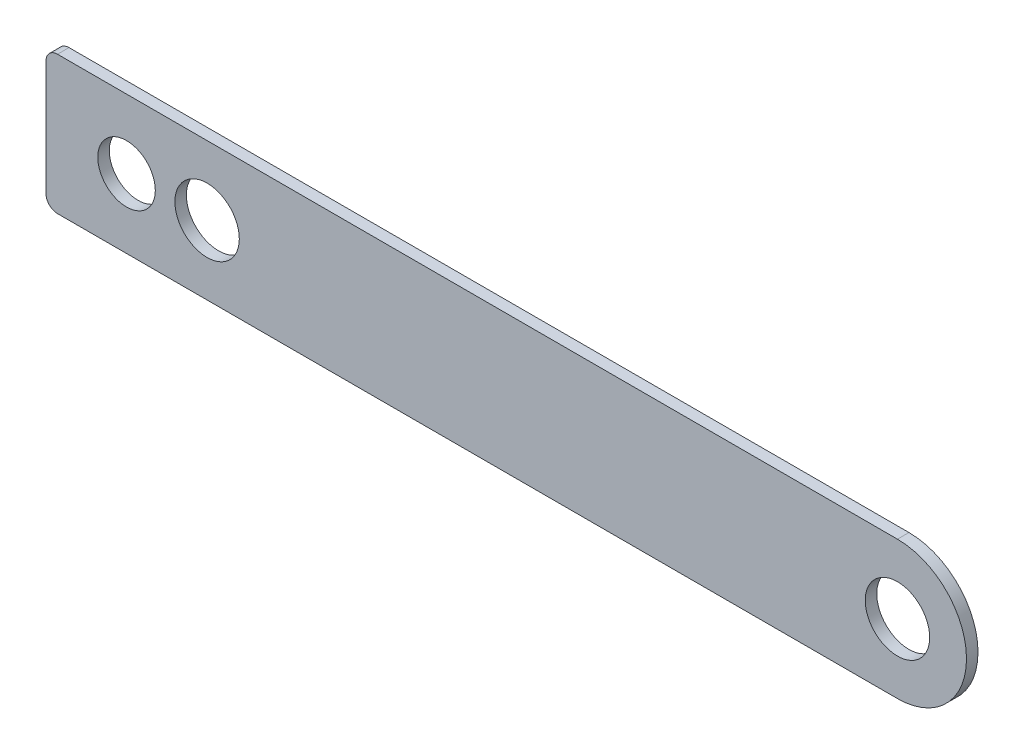
ISO-10303-21;
HEADER;
FILE_DESCRIPTION(('STEP AP214'),'2;1');
FILE_NAME('part.step','',(''),(''),'','','');
FILE_SCHEMA(('AUTOMOTIVE_DESIGN { 1 0 10303 214 1 1 1 1 }'));
ENDSEC;
DATA;
#1=APPLICATION_CONTEXT('core data for automotive mechanical design processes');
#2=APPLICATION_PROTOCOL_DEFINITION('international standard','automotive_design',2000,#1);
#3=PRODUCT_CONTEXT('',#1,'mechanical');
#4=PRODUCT('Part','Part','',(#3));
#5=PRODUCT_RELATED_PRODUCT_CATEGORY('part','',(#4));
#6=PRODUCT_DEFINITION_FORMATION('','',#4);
#7=PRODUCT_DEFINITION_CONTEXT('part definition',#1,'design');
#8=PRODUCT_DEFINITION('design','',#6,#7);
#9=PRODUCT_DEFINITION_SHAPE('','',#8);
#10=(LENGTH_UNIT() NAMED_UNIT(*) SI_UNIT(.MILLI.,.METRE.));
#11=(NAMED_UNIT(*) PLANE_ANGLE_UNIT() SI_UNIT($,.RADIAN.));
#12=(NAMED_UNIT(*) SI_UNIT($,.STERADIAN.) SOLID_ANGLE_UNIT());
#13=UNCERTAINTY_MEASURE_WITH_UNIT(LENGTH_MEASURE(1.E-05),#10,'distance_accuracy_value','');
#14=(GEOMETRIC_REPRESENTATION_CONTEXT(3) GLOBAL_UNCERTAINTY_ASSIGNED_CONTEXT((#13)) GLOBAL_UNIT_ASSIGNED_CONTEXT((#10,
#11,#12)) REPRESENTATION_CONTEXT('',''));
#15=CARTESIAN_POINT('',(0.,0.,0.));
#16=DIRECTION('',(0.,0.,1.));
#17=DIRECTION('',(1.,0.,0.));
#18=AXIS2_PLACEMENT_3D('',#15,#16,#17);
#19=CARTESIAN_POINT('',(370.,30.,5.));
#20=DIRECTION('',(0.,0.,-1.));
#21=DIRECTION('',(-1.,0.,0.));
#22=AXIS2_PLACEMENT_3D('',#19,#20,#21);
#23=CYLINDRICAL_SURFACE('',#22,30.);
#24=CARTESIAN_POINT('',(370.,30.,0.));
#25=DIRECTION('',(0.,0.,1.));
#26=DIRECTION('',(-1.,0.,0.));
#27=AXIS2_PLACEMENT_3D('',#24,#25,#26);
#28=CIRCLE('',#27,30.);
#29=CARTESIAN_POINT('',(370.,0.,0.));
#30=VERTEX_POINT('',#29);
#31=CARTESIAN_POINT('',(370.,60.,0.));
#32=VERTEX_POINT('',#31);
#33=EDGE_CURVE('E123',#30,#32,#28,.T.);
#34=ORIENTED_EDGE('',*,*,#33,.T.);
#35=DIRECTION('',(0.,0.,-1.));
#36=VECTOR('',#35,1.);
#37=CARTESIAN_POINT('',(370.,60.,5.));
#38=LINE('',#37,#36);
#39=CARTESIAN_POINT('',(370.,60.,5.));
#40=VERTEX_POINT('',#39);
#41=EDGE_CURVE('E11',#40,#32,#38,.T.);
#42=ORIENTED_EDGE('',*,*,#41,.F.);
#43=CARTESIAN_POINT('',(370.,30.,5.));
#44=DIRECTION('',(0.,0.,1.));
#45=DIRECTION('',(-1.,0.,0.));
#46=AXIS2_PLACEMENT_3D('',#43,#44,#45);
#47=CIRCLE('',#46,30.);
#48=CARTESIAN_POINT('',(370.,0.,5.));
#49=VERTEX_POINT('',#48);
#50=EDGE_CURVE('E134',#49,#40,#47,.T.);
#51=ORIENTED_EDGE('',*,*,#50,.F.);
#52=DIRECTION('',(0.,0.,-1.));
#53=VECTOR('',#52,1.);
#54=CARTESIAN_POINT('',(370.,0.,5.));
#55=LINE('',#54,#53);
#56=EDGE_CURVE('E119',#49,#30,#55,.T.);
#57=ORIENTED_EDGE('',*,*,#56,.T.);
#58=EDGE_LOOP('',(#34,#42,#51,#57));
#59=FACE_BOUND('',#58,.T.);
#60=ADVANCED_FACE('F39',(#59),#23,.T.);
#61=CARTESIAN_POINT('',(5.00000000000004,60.,5.));
#62=DIRECTION('',(0.,-1.,0.));
#63=DIRECTION('',(0.,0.,-1.));
#64=AXIS2_PLACEMENT_3D('',#61,#62,#63);
#65=PLANE('',#64);
#66=DIRECTION('',(-1.,0.,0.));
#67=VECTOR('',#66,1.);
#68=CARTESIAN_POINT('',(5.00000000000004,60.,0.));
#69=LINE('',#68,#67);
#70=CARTESIAN_POINT('',(5.00000000000004,60.,0.));
#71=VERTEX_POINT('',#70);
#72=EDGE_CURVE('E126',#32,#71,#69,.T.);
#73=ORIENTED_EDGE('',*,*,#72,.T.);
#74=DIRECTION('',(0.,0.,-1.));
#75=VECTOR('',#74,1.);
#76=CARTESIAN_POINT('',(5.00000000000004,60.,5.));
#77=LINE('',#76,#75);
#78=CARTESIAN_POINT('',(5.00000000000004,60.,5.));
#79=VERTEX_POINT('',#78);
#80=EDGE_CURVE('E47',#79,#71,#77,.T.);
#81=ORIENTED_EDGE('',*,*,#80,.F.);
#82=DIRECTION('',(-1.,0.,0.));
#83=VECTOR('',#82,1.);
#84=CARTESIAN_POINT('',(5.00000000000004,60.,5.));
#85=LINE('',#84,#83);
#86=EDGE_CURVE('E92',#40,#79,#85,.T.);
#87=ORIENTED_EDGE('',*,*,#86,.F.);
#88=ORIENTED_EDGE('',*,*,#41,.T.);
#89=EDGE_LOOP('',(#73,#81,#87,#88));
#90=FACE_BOUND('',#89,.T.);
#91=ADVANCED_FACE('F159',(#90),#65,.F.);
#92=CARTESIAN_POINT('',(5.,55.,5.));
#93=DIRECTION('',(0.,0.,-1.));
#94=DIRECTION('',(-1.,0.,0.));
#95=AXIS2_PLACEMENT_3D('',#92,#93,#94);
#96=CYLINDRICAL_SURFACE('',#95,5.);
#97=CARTESIAN_POINT('',(5.,55.,0.));
#98=DIRECTION('',(0.,0.,1.));
#99=DIRECTION('',(-1.,0.,0.));
#100=AXIS2_PLACEMENT_3D('',#97,#98,#99);
#101=CIRCLE('',#100,5.);
#102=CARTESIAN_POINT('',(0.,55.,0.));
#103=VERTEX_POINT('',#102);
#104=EDGE_CURVE('E129',#71,#103,#101,.T.);
#105=ORIENTED_EDGE('',*,*,#104,.T.);
#106=DIRECTION('',(0.,0.,-1.));
#107=VECTOR('',#106,1.);
#108=CARTESIAN_POINT('',(0.,55.,5.));
#109=LINE('',#108,#107);
#110=CARTESIAN_POINT('',(0.,55.,5.));
#111=VERTEX_POINT('',#110);
#112=EDGE_CURVE('E114',#111,#103,#109,.T.);
#113=ORIENTED_EDGE('',*,*,#112,.F.);
#114=CARTESIAN_POINT('',(5.,55.,5.));
#115=DIRECTION('',(0.,0.,1.));
#116=DIRECTION('',(-1.,0.,0.));
#117=AXIS2_PLACEMENT_3D('',#114,#115,#116);
#118=CIRCLE('',#117,5.);
#119=EDGE_CURVE('E105',#79,#111,#118,.T.);
#120=ORIENTED_EDGE('',*,*,#119,.F.);
#121=ORIENTED_EDGE('',*,*,#80,.T.);
#122=EDGE_LOOP('',(#105,#113,#120,#121));
#123=FACE_BOUND('',#122,.T.);
#124=ADVANCED_FACE('F140',(#123),#96,.T.);
#125=CARTESIAN_POINT('',(0.,5.00000000000004,5.));
#126=DIRECTION('',(1.,0.,0.));
#127=DIRECTION('',(0.,0.,-1.));
#128=AXIS2_PLACEMENT_3D('',#125,#126,#127);
#129=PLANE('',#128);
#130=DIRECTION('',(0.,-1.,0.));
#131=VECTOR('',#130,1.);
#132=CARTESIAN_POINT('',(0.,5.00000000000004,0.));
#133=LINE('',#132,#131);
#134=CARTESIAN_POINT('',(0.,5.00000000000004,0.));
#135=VERTEX_POINT('',#134);
#136=EDGE_CURVE('E113',#103,#135,#133,.T.);
#137=ORIENTED_EDGE('',*,*,#136,.T.);
#138=DIRECTION('',(0.,0.,-1.));
#139=VECTOR('',#138,1.);
#140=CARTESIAN_POINT('',(0.,5.00000000000004,5.));
#141=LINE('',#140,#139);
#142=CARTESIAN_POINT('',(0.,5.00000000000004,5.));
#143=VERTEX_POINT('',#142);
#144=EDGE_CURVE('E110',#143,#135,#141,.T.);
#145=ORIENTED_EDGE('',*,*,#144,.F.);
#146=DIRECTION('',(0.,-1.,0.));
#147=VECTOR('',#146,1.);
#148=CARTESIAN_POINT('',(0.,5.00000000000004,5.));
#149=LINE('',#148,#147);
#150=EDGE_CURVE('E99',#111,#143,#149,.T.);
#151=ORIENTED_EDGE('',*,*,#150,.F.);
#152=ORIENTED_EDGE('',*,*,#112,.T.);
#153=EDGE_LOOP('',(#137,#145,#151,#152));
#154=FACE_BOUND('',#153,.T.);
#155=ADVANCED_FACE('F111',(#154),#129,.F.);
#156=CARTESIAN_POINT('',(5.,5.,5.));
#157=DIRECTION('',(0.,0.,-1.));
#158=DIRECTION('',(-1.,0.,0.));
#159=AXIS2_PLACEMENT_3D('',#156,#157,#158);
#160=CYLINDRICAL_SURFACE('',#159,5.);
#161=CARTESIAN_POINT('',(5.,5.,0.));
#162=DIRECTION('',(0.,0.,1.));
#163=DIRECTION('',(-1.,0.,0.));
#164=AXIS2_PLACEMENT_3D('',#161,#162,#163);
#165=CIRCLE('',#164,5.);
#166=CARTESIAN_POINT('',(5.00000000000004,0.,0.));
#167=VERTEX_POINT('',#166);
#168=EDGE_CURVE('E78',#135,#167,#165,.T.);
#169=ORIENTED_EDGE('',*,*,#168,.T.);
#170=DIRECTION('',(0.,0.,-1.));
#171=VECTOR('',#170,1.);
#172=CARTESIAN_POINT('',(5.00000000000004,0.,5.));
#173=LINE('',#172,#171);
#174=CARTESIAN_POINT('',(5.00000000000004,0.,5.));
#175=VERTEX_POINT('',#174);
#176=EDGE_CURVE('E115',#175,#167,#173,.T.);
#177=ORIENTED_EDGE('',*,*,#176,.F.);
#178=CARTESIAN_POINT('',(5.,5.,5.));
#179=DIRECTION('',(0.,0.,1.));
#180=DIRECTION('',(-1.,0.,0.));
#181=AXIS2_PLACEMENT_3D('',#178,#179,#180);
#182=CIRCLE('',#181,5.);
#183=EDGE_CURVE('E103',#143,#175,#182,.T.);
#184=ORIENTED_EDGE('',*,*,#183,.F.);
#185=ORIENTED_EDGE('',*,*,#144,.T.);
#186=EDGE_LOOP('',(#169,#177,#184,#185));
#187=FACE_BOUND('',#186,.T.);
#188=ADVANCED_FACE('F117',(#187),#160,.T.);
#189=CARTESIAN_POINT('',(5.00000000000004,0.,5.));
#190=DIRECTION('',(0.,1.,0.));
#191=DIRECTION('',(0.,0.,1.));
#192=AXIS2_PLACEMENT_3D('',#189,#190,#191);
#193=PLANE('',#192);
#194=DIRECTION('',(1.,0.,0.));
#195=VECTOR('',#194,1.);
#196=CARTESIAN_POINT('',(5.00000000000004,0.,0.));
#197=LINE('',#196,#195);
#198=EDGE_CURVE('E84',#167,#30,#197,.T.);
#199=ORIENTED_EDGE('',*,*,#198,.T.);
#200=ORIENTED_EDGE('',*,*,#56,.F.);
#201=DIRECTION('',(1.,0.,0.));
#202=VECTOR('',#201,1.);
#203=CARTESIAN_POINT('',(5.00000000000004,0.,5.));
#204=LINE('',#203,#202);
#205=EDGE_CURVE('E55',#175,#49,#204,.T.);
#206=ORIENTED_EDGE('',*,*,#205,.F.);
#207=ORIENTED_EDGE('',*,*,#176,.T.);
#208=EDGE_LOOP('',(#199,#200,#206,#207));
#209=FACE_BOUND('',#208,.T.);
#210=ADVANCED_FACE('F147',(#209),#193,.F.);
#211=CARTESIAN_POINT('',(370.,30.,5.));
#212=DIRECTION('',(0.,0.,-1.));
#213=DIRECTION('',(-1.,0.,0.));
#214=AXIS2_PLACEMENT_3D('',#211,#212,#213);
#215=PLANE('',#214);
#216=CARTESIAN_POINT('',(35.,30.,5.));
#217=DIRECTION('',(0.,0.,1.));
#218=DIRECTION('',(1.,0.,0.));
#219=AXIS2_PLACEMENT_3D('',#216,#217,#218);
#220=CIRCLE('',#219,12.5);
#221=CARTESIAN_POINT('',(47.5,30.,5.));
#222=VERTEX_POINT('',#221);
#223=EDGE_CURVE('E270',#222,#222,#220,.T.);
#224=ORIENTED_EDGE('',*,*,#223,.F.);
#225=EDGE_LOOP('',(#224));
#226=FACE_BOUND('',#225,.T.);
#227=CARTESIAN_POINT('',(370.,30.,5.));
#228=DIRECTION('',(0.,0.,1.));
#229=DIRECTION('',(1.,0.,0.));
#230=AXIS2_PLACEMENT_3D('',#227,#228,#229);
#231=CIRCLE('',#230,14.);
#232=CARTESIAN_POINT('',(384.,30.,5.));
#233=VERTEX_POINT('',#232);
#234=EDGE_CURVE('E271',#233,#233,#231,.T.);
#235=ORIENTED_EDGE('',*,*,#234,.F.);
#236=EDGE_LOOP('',(#235));
#237=FACE_BOUND('',#236,.T.);
#238=CARTESIAN_POINT('',(70.,30.,5.));
#239=DIRECTION('',(0.,0.,1.));
#240=DIRECTION('',(1.,0.,0.));
#241=AXIS2_PLACEMENT_3D('',#238,#239,#240);
#242=CIRCLE('',#241,14.);
#243=CARTESIAN_POINT('',(84.,30.,5.));
#244=VERTEX_POINT('',#243);
#245=EDGE_CURVE('E280',#244,#244,#242,.T.);
#246=ORIENTED_EDGE('',*,*,#245,.F.);
#247=EDGE_LOOP('',(#246));
#248=FACE_BOUND('',#247,.T.);
#249=ORIENTED_EDGE('',*,*,#50,.T.);
#250=ORIENTED_EDGE('',*,*,#86,.T.);
#251=ORIENTED_EDGE('',*,*,#119,.T.);
#252=ORIENTED_EDGE('',*,*,#150,.T.);
#253=ORIENTED_EDGE('',*,*,#183,.T.);
#254=ORIENTED_EDGE('',*,*,#205,.T.);
#255=EDGE_LOOP('',(#249,#250,#251,#252,#253,#254));
#256=FACE_BOUND('',#255,.T.);
#257=ADVANCED_FACE('F101',(#226,#237,#248,#256),#215,.F.);
#258=CARTESIAN_POINT('',(370.,30.,0.));
#259=DIRECTION('',(0.,0.,-1.));
#260=DIRECTION('',(-1.,0.,0.));
#261=AXIS2_PLACEMENT_3D('',#258,#259,#260);
#262=PLANE('',#261);
#263=CARTESIAN_POINT('',(35.,30.,0.));
#264=DIRECTION('',(0.,0.,1.));
#265=DIRECTION('',(1.,0.,0.));
#266=AXIS2_PLACEMENT_3D('',#263,#264,#265);
#267=CIRCLE('',#266,12.5);
#268=CARTESIAN_POINT('',(47.5,30.,0.));
#269=VERTEX_POINT('',#268);
#270=EDGE_CURVE('E127',#269,#269,#267,.T.);
#271=ORIENTED_EDGE('',*,*,#270,.T.);
#272=EDGE_LOOP('',(#271));
#273=FACE_BOUND('',#272,.T.);
#274=CARTESIAN_POINT('',(370.,30.,0.));
#275=DIRECTION('',(0.,0.,1.));
#276=DIRECTION('',(1.,0.,0.));
#277=AXIS2_PLACEMENT_3D('',#274,#275,#276);
#278=CIRCLE('',#277,14.);
#279=CARTESIAN_POINT('',(384.,30.,0.));
#280=VERTEX_POINT('',#279);
#281=EDGE_CURVE('E275',#280,#280,#278,.T.);
#282=ORIENTED_EDGE('',*,*,#281,.T.);
#283=EDGE_LOOP('',(#282));
#284=FACE_BOUND('',#283,.T.);
#285=CARTESIAN_POINT('',(70.,30.,0.));
#286=DIRECTION('',(0.,0.,1.));
#287=DIRECTION('',(1.,0.,0.));
#288=AXIS2_PLACEMENT_3D('',#285,#286,#287);
#289=CIRCLE('',#288,14.);
#290=CARTESIAN_POINT('',(84.,30.,0.));
#291=VERTEX_POINT('',#290);
#292=EDGE_CURVE('E283',#291,#291,#289,.T.);
#293=ORIENTED_EDGE('',*,*,#292,.T.);
#294=EDGE_LOOP('',(#293));
#295=FACE_BOUND('',#294,.T.);
#296=ORIENTED_EDGE('',*,*,#33,.F.);
#297=ORIENTED_EDGE('',*,*,#198,.F.);
#298=ORIENTED_EDGE('',*,*,#168,.F.);
#299=ORIENTED_EDGE('',*,*,#136,.F.);
#300=ORIENTED_EDGE('',*,*,#104,.F.);
#301=ORIENTED_EDGE('',*,*,#72,.F.);
#302=EDGE_LOOP('',(#296,#297,#298,#299,#300,#301));
#303=FACE_BOUND('',#302,.T.);
#304=ADVANCED_FACE('F143',(#273,#284,#295,#303),#262,.T.);
#305=CARTESIAN_POINT('',(70.,30.,0.));
#306=DIRECTION('',(0.,0.,1.));
#307=DIRECTION('',(1.,0.,0.));
#308=AXIS2_PLACEMENT_3D('',#305,#306,#307);
#309=CYLINDRICAL_SURFACE('',#308,14.);
#310=ORIENTED_EDGE('',*,*,#292,.F.);
#311=EDGE_LOOP('',(#310));
#312=FACE_BOUND('',#311,.T.);
#313=ORIENTED_EDGE('',*,*,#245,.T.);
#314=EDGE_LOOP('',(#313));
#315=FACE_BOUND('',#314,.T.);
#316=ADVANCED_FACE('F199',(#312,#315),#309,.F.);
#317=CARTESIAN_POINT('',(370.,30.,0.));
#318=DIRECTION('',(0.,0.,1.));
#319=DIRECTION('',(1.,0.,0.));
#320=AXIS2_PLACEMENT_3D('',#317,#318,#319);
#321=CYLINDRICAL_SURFACE('',#320,14.);
#322=ORIENTED_EDGE('',*,*,#281,.F.);
#323=EDGE_LOOP('',(#322));
#324=FACE_BOUND('',#323,.T.);
#325=ORIENTED_EDGE('',*,*,#234,.T.);
#326=EDGE_LOOP('',(#325));
#327=FACE_BOUND('',#326,.T.);
#328=ADVANCED_FACE('F209',(#324,#327),#321,.F.);
#329=CARTESIAN_POINT('',(35.,30.,0.));
#330=DIRECTION('',(0.,0.,1.));
#331=DIRECTION('',(1.,0.,0.));
#332=AXIS2_PLACEMENT_3D('',#329,#330,#331);
#333=CYLINDRICAL_SURFACE('',#332,12.5);
#334=ORIENTED_EDGE('',*,*,#270,.F.);
#335=EDGE_LOOP('',(#334));
#336=FACE_BOUND('',#335,.T.);
#337=ORIENTED_EDGE('',*,*,#223,.T.);
#338=EDGE_LOOP('',(#337));
#339=FACE_BOUND('',#338,.T.);
#340=ADVANCED_FACE('F220',(#336,#339),#333,.F.);
#341=CLOSED_SHELL('',(#60,#91,#124,#155,#188,#210,#257,#304,#316,#328,#340));
#342=MANIFOLD_SOLID_BREP('B2',#341);
#343=ADVANCED_BREP_SHAPE_REPRESENTATION('',(#18,#342),#14);
#344=SHAPE_DEFINITION_REPRESENTATION(#9,#343);
ENDSEC;
END-ISO-10303-21;
